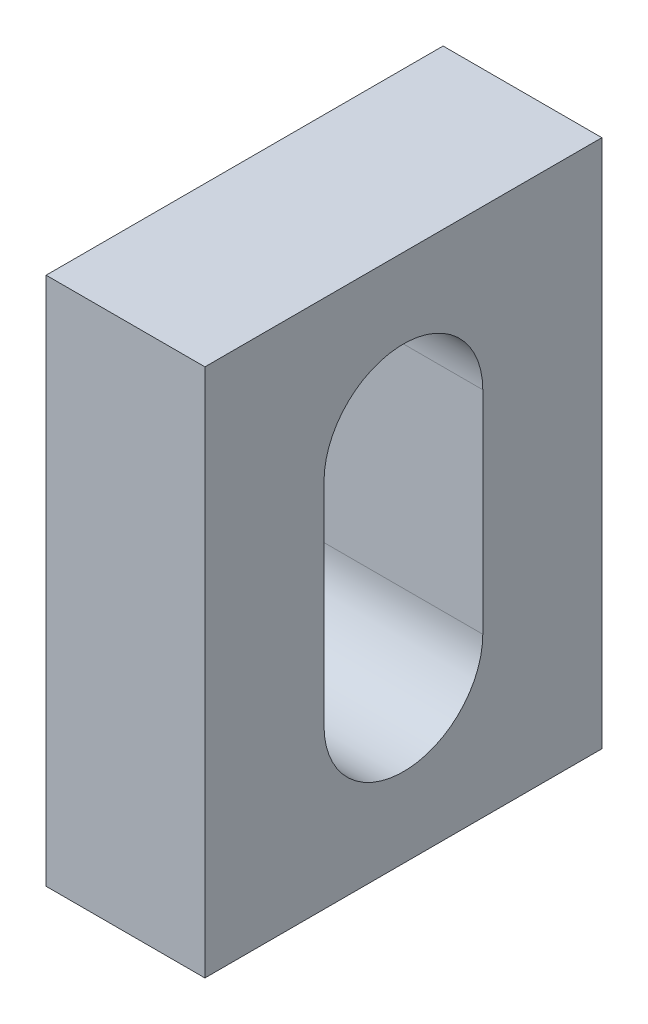
ISO-10303-21;
HEADER;
FILE_DESCRIPTION(('STEP AP214'),'2;1');
FILE_NAME('part.step','',(''),(''),'','','');
FILE_SCHEMA(('AUTOMOTIVE_DESIGN { 1 0 10303 214 1 1 1 1 }'));
ENDSEC;
DATA;
#1=APPLICATION_CONTEXT('core data for automotive mechanical design processes');
#2=APPLICATION_PROTOCOL_DEFINITION('international standard','automotive_design',2000,#1);
#3=PRODUCT_CONTEXT('',#1,'mechanical');
#4=PRODUCT('Part','Part','',(#3));
#5=PRODUCT_RELATED_PRODUCT_CATEGORY('part','',(#4));
#6=PRODUCT_DEFINITION_FORMATION('','',#4);
#7=PRODUCT_DEFINITION_CONTEXT('part definition',#1,'design');
#8=PRODUCT_DEFINITION('design','',#6,#7);
#9=PRODUCT_DEFINITION_SHAPE('','',#8);
#10=(LENGTH_UNIT() NAMED_UNIT(*) SI_UNIT(.MILLI.,.METRE.));
#11=(NAMED_UNIT(*) PLANE_ANGLE_UNIT() SI_UNIT($,.RADIAN.));
#12=(NAMED_UNIT(*) SI_UNIT($,.STERADIAN.) SOLID_ANGLE_UNIT());
#13=UNCERTAINTY_MEASURE_WITH_UNIT(LENGTH_MEASURE(1.E-05),#10,'distance_accuracy_value','');
#14=(GEOMETRIC_REPRESENTATION_CONTEXT(3) GLOBAL_UNCERTAINTY_ASSIGNED_CONTEXT((#13)) GLOBAL_UNIT_ASSIGNED_CONTEXT((#10,
#11,#12)) REPRESENTATION_CONTEXT('',''));
#15=CARTESIAN_POINT('',(0.,0.,0.));
#16=DIRECTION('',(0.,0.,1.));
#17=DIRECTION('',(1.,0.,0.));
#18=AXIS2_PLACEMENT_3D('',#15,#16,#17);
#19=CARTESIAN_POINT('',(6.,0.,0.));
#20=DIRECTION('',(-1.,0.,0.));
#21=DIRECTION('',(0.,0.,1.));
#22=AXIS2_PLACEMENT_3D('',#19,#20,#21);
#23=PLANE('',#22);
#24=DIRECTION('',(0.,-1.,0.));
#25=VECTOR('',#24,1.);
#26=CARTESIAN_POINT('',(6.,0.,0.));
#27=LINE('',#26,#25);
#28=CARTESIAN_POINT('',(6.,20.,0.));
#29=VERTEX_POINT('',#28);
#30=CARTESIAN_POINT('',(6.,0.,0.));
#31=VERTEX_POINT('',#30);
#32=EDGE_CURVE('E134',#29,#31,#27,.T.);
#33=ORIENTED_EDGE('',*,*,#32,.T.);
#34=DIRECTION('',(0.,0.,-1.));
#35=VECTOR('',#34,1.);
#36=CARTESIAN_POINT('',(6.,0.,0.));
#37=LINE('',#36,#35);
#38=CARTESIAN_POINT('',(6.,0.,-15.));
#39=VERTEX_POINT('',#38);
#40=EDGE_CURVE('E137',#31,#39,#37,.T.);
#41=ORIENTED_EDGE('',*,*,#40,.T.);
#42=DIRECTION('',(0.,1.,0.));
#43=VECTOR('',#42,1.);
#44=CARTESIAN_POINT('',(6.,0.,-15.));
#45=LINE('',#44,#43);
#46=CARTESIAN_POINT('',(6.,20.,-15.));
#47=VERTEX_POINT('',#46);
#48=EDGE_CURVE('E140',#39,#47,#45,.T.);
#49=ORIENTED_EDGE('',*,*,#48,.T.);
#50=DIRECTION('',(0.,0.,1.));
#51=VECTOR('',#50,1.);
#52=CARTESIAN_POINT('',(6.,20.,0.));
#53=LINE('',#52,#51);
#54=EDGE_CURVE('E142',#47,#29,#53,.T.);
#55=ORIENTED_EDGE('',*,*,#54,.T.);
#56=EDGE_LOOP('',(#33,#41,#49,#55));
#57=FACE_BOUND('',#56,.T.);
#58=CARTESIAN_POINT('',(6.,6.,-7.5));
#59=DIRECTION('',(1.,0.,0.));
#60=DIRECTION('',(0.,0.,-1.));
#61=AXIS2_PLACEMENT_3D('',#58,#59,#60);
#62=CIRCLE('',#61,3.);
#63=CARTESIAN_POINT('',(6.,6.,-4.5));
#64=VERTEX_POINT('',#63);
#65=CARTESIAN_POINT('',(6.,6.,-10.5));
#66=VERTEX_POINT('',#65);
#67=EDGE_CURVE('E98',#64,#66,#62,.T.);
#68=ORIENTED_EDGE('',*,*,#67,.F.);
#69=DIRECTION('',(0.,-1.,0.));
#70=VECTOR('',#69,1.);
#71=CARTESIAN_POINT('',(6.,6.,-4.5));
#72=LINE('',#71,#70);
#73=CARTESIAN_POINT('',(6.,14.,-4.5));
#74=VERTEX_POINT('',#73);
#75=EDGE_CURVE('E120',#74,#64,#72,.T.);
#76=ORIENTED_EDGE('',*,*,#75,.F.);
#77=CARTESIAN_POINT('',(6.,14.,-7.5));
#78=DIRECTION('',(1.,0.,0.));
#79=DIRECTION('',(0.,0.,-1.));
#80=AXIS2_PLACEMENT_3D('',#77,#78,#79);
#81=CIRCLE('',#80,3.);
#82=CARTESIAN_POINT('',(6.,14.,-10.5));
#83=VERTEX_POINT('',#82);
#84=EDGE_CURVE('E118',#83,#74,#81,.T.);
#85=ORIENTED_EDGE('',*,*,#84,.F.);
#86=DIRECTION('',(0.,1.,0.));
#87=VECTOR('',#86,1.);
#88=CARTESIAN_POINT('',(6.,6.,-10.5));
#89=LINE('',#88,#87);
#90=EDGE_CURVE('E106',#66,#83,#89,.T.);
#91=ORIENTED_EDGE('',*,*,#90,.F.);
#92=EDGE_LOOP('',(#68,#76,#85,#91));
#93=FACE_BOUND('',#92,.T.);
#94=ADVANCED_FACE('F33',(#57,#93),#23,.F.);
#95=CARTESIAN_POINT('',(0.,0.,0.));
#96=DIRECTION('',(-1.,0.,0.));
#97=DIRECTION('',(0.,0.,1.));
#98=AXIS2_PLACEMENT_3D('',#95,#96,#97);
#99=PLANE('',#98);
#100=DIRECTION('',(0.,-1.,0.));
#101=VECTOR('',#100,1.);
#102=CARTESIAN_POINT('',(0.,0.,0.));
#103=LINE('',#102,#101);
#104=CARTESIAN_POINT('',(0.,20.,0.));
#105=VERTEX_POINT('',#104);
#106=CARTESIAN_POINT('',(0.,0.,0.));
#107=VERTEX_POINT('',#106);
#108=EDGE_CURVE('E114',#105,#107,#103,.T.);
#109=ORIENTED_EDGE('',*,*,#108,.F.);
#110=DIRECTION('',(0.,0.,1.));
#111=VECTOR('',#110,1.);
#112=CARTESIAN_POINT('',(0.,20.,0.));
#113=LINE('',#112,#111);
#114=CARTESIAN_POINT('',(0.,20.,-15.));
#115=VERTEX_POINT('',#114);
#116=EDGE_CURVE('E138',#115,#105,#113,.T.);
#117=ORIENTED_EDGE('',*,*,#116,.F.);
#118=DIRECTION('',(0.,1.,0.));
#119=VECTOR('',#118,1.);
#120=CARTESIAN_POINT('',(0.,0.,-15.));
#121=LINE('',#120,#119);
#122=CARTESIAN_POINT('',(0.,0.,-15.));
#123=VERTEX_POINT('',#122);
#124=EDGE_CURVE('E149',#123,#115,#121,.T.);
#125=ORIENTED_EDGE('',*,*,#124,.F.);
#126=DIRECTION('',(0.,0.,-1.));
#127=VECTOR('',#126,1.);
#128=CARTESIAN_POINT('',(0.,0.,0.));
#129=LINE('',#128,#127);
#130=EDGE_CURVE('E147',#107,#123,#129,.T.);
#131=ORIENTED_EDGE('',*,*,#130,.F.);
#132=EDGE_LOOP('',(#109,#117,#125,#131));
#133=FACE_BOUND('',#132,.T.);
#134=DIRECTION('',(0.,-1.,0.));
#135=VECTOR('',#134,1.);
#136=CARTESIAN_POINT('',(0.,6.,-4.5));
#137=LINE('',#136,#135);
#138=CARTESIAN_POINT('',(0.,14.,-4.5));
#139=VERTEX_POINT('',#138);
#140=CARTESIAN_POINT('',(0.,6.,-4.5));
#141=VERTEX_POINT('',#140);
#142=EDGE_CURVE('E107',#139,#141,#137,.T.);
#143=ORIENTED_EDGE('',*,*,#142,.T.);
#144=CARTESIAN_POINT('',(0.,6.,-7.5));
#145=DIRECTION('',(1.,0.,0.));
#146=DIRECTION('',(0.,0.,-1.));
#147=AXIS2_PLACEMENT_3D('',#144,#145,#146);
#148=CIRCLE('',#147,3.);
#149=CARTESIAN_POINT('',(0.,6.,-10.5));
#150=VERTEX_POINT('',#149);
#151=EDGE_CURVE('E56',#141,#150,#148,.T.);
#152=ORIENTED_EDGE('',*,*,#151,.T.);
#153=DIRECTION('',(0.,1.,0.));
#154=VECTOR('',#153,1.);
#155=CARTESIAN_POINT('',(0.,6.,-10.5));
#156=LINE('',#155,#154);
#157=CARTESIAN_POINT('',(0.,14.,-10.5));
#158=VERTEX_POINT('',#157);
#159=EDGE_CURVE('E113',#150,#158,#156,.T.);
#160=ORIENTED_EDGE('',*,*,#159,.T.);
#161=CARTESIAN_POINT('',(0.,14.,-7.5));
#162=DIRECTION('',(1.,0.,0.));
#163=DIRECTION('',(0.,0.,-1.));
#164=AXIS2_PLACEMENT_3D('',#161,#162,#163);
#165=CIRCLE('',#164,3.);
#166=EDGE_CURVE('E126',#158,#139,#165,.T.);
#167=ORIENTED_EDGE('',*,*,#166,.T.);
#168=EDGE_LOOP('',(#143,#152,#160,#167));
#169=FACE_BOUND('',#168,.T.);
#170=ADVANCED_FACE('F167',(#133,#169),#99,.T.);
#171=CARTESIAN_POINT('',(6.,0.,0.));
#172=DIRECTION('',(0.,0.,-1.));
#173=DIRECTION('',(0.,1.,0.));
#174=AXIS2_PLACEMENT_3D('',#171,#172,#173);
#175=PLANE('',#174);
#176=ORIENTED_EDGE('',*,*,#108,.T.);
#177=DIRECTION('',(-1.,0.,0.));
#178=VECTOR('',#177,1.);
#179=CARTESIAN_POINT('',(6.,0.,0.));
#180=LINE('',#179,#178);
#181=EDGE_CURVE('E11',#31,#107,#180,.T.);
#182=ORIENTED_EDGE('',*,*,#181,.F.);
#183=ORIENTED_EDGE('',*,*,#32,.F.);
#184=DIRECTION('',(-1.,0.,0.));
#185=VECTOR('',#184,1.);
#186=CARTESIAN_POINT('',(6.,20.,0.));
#187=LINE('',#186,#185);
#188=EDGE_CURVE('E144',#29,#105,#187,.T.);
#189=ORIENTED_EDGE('',*,*,#188,.T.);
#190=EDGE_LOOP('',(#176,#182,#183,#189));
#191=FACE_BOUND('',#190,.T.);
#192=ADVANCED_FACE('F35',(#191),#175,.F.);
#193=CARTESIAN_POINT('',(6.,0.,0.));
#194=DIRECTION('',(0.,1.,0.));
#195=DIRECTION('',(0.,0.,1.));
#196=AXIS2_PLACEMENT_3D('',#193,#194,#195);
#197=PLANE('',#196);
#198=ORIENTED_EDGE('',*,*,#130,.T.);
#199=DIRECTION('',(-1.,0.,0.));
#200=VECTOR('',#199,1.);
#201=CARTESIAN_POINT('',(6.,0.,-15.));
#202=LINE('',#201,#200);
#203=EDGE_CURVE('E41',#39,#123,#202,.T.);
#204=ORIENTED_EDGE('',*,*,#203,.F.);
#205=ORIENTED_EDGE('',*,*,#40,.F.);
#206=ORIENTED_EDGE('',*,*,#181,.T.);
#207=EDGE_LOOP('',(#198,#204,#205,#206));
#208=FACE_BOUND('',#207,.T.);
#209=ADVANCED_FACE('F177',(#208),#197,.F.);
#210=CARTESIAN_POINT('',(6.,0.,-15.));
#211=DIRECTION('',(0.,0.,1.));
#212=DIRECTION('',(0.,-1.,0.));
#213=AXIS2_PLACEMENT_3D('',#210,#211,#212);
#214=PLANE('',#213);
#215=ORIENTED_EDGE('',*,*,#124,.T.);
#216=DIRECTION('',(-1.,0.,0.));
#217=VECTOR('',#216,1.);
#218=CARTESIAN_POINT('',(6.,20.,-15.));
#219=LINE('',#218,#217);
#220=EDGE_CURVE('E154',#47,#115,#219,.T.);
#221=ORIENTED_EDGE('',*,*,#220,.F.);
#222=ORIENTED_EDGE('',*,*,#48,.F.);
#223=ORIENTED_EDGE('',*,*,#203,.T.);
#224=EDGE_LOOP('',(#215,#221,#222,#223));
#225=FACE_BOUND('',#224,.T.);
#226=ADVANCED_FACE('F161',(#225),#214,.F.);
#227=CARTESIAN_POINT('',(6.,20.,0.));
#228=DIRECTION('',(0.,-1.,0.));
#229=DIRECTION('',(0.,0.,-1.));
#230=AXIS2_PLACEMENT_3D('',#227,#228,#229);
#231=PLANE('',#230);
#232=ORIENTED_EDGE('',*,*,#116,.T.);
#233=ORIENTED_EDGE('',*,*,#188,.F.);
#234=ORIENTED_EDGE('',*,*,#54,.F.);
#235=ORIENTED_EDGE('',*,*,#220,.T.);
#236=EDGE_LOOP('',(#232,#233,#234,#235));
#237=FACE_BOUND('',#236,.T.);
#238=ADVANCED_FACE('F171',(#237),#231,.F.);
#239=CARTESIAN_POINT('',(6.,6.,-7.5));
#240=DIRECTION('',(-1.,0.,0.));
#241=DIRECTION('',(0.,0.,1.));
#242=AXIS2_PLACEMENT_3D('',#239,#240,#241);
#243=CYLINDRICAL_SURFACE('',#242,3.);
#244=ORIENTED_EDGE('',*,*,#151,.F.);
#245=DIRECTION('',(-1.,0.,0.));
#246=VECTOR('',#245,1.);
#247=CARTESIAN_POINT('',(6.,6.,-4.5));
#248=LINE('',#247,#246);
#249=EDGE_CURVE('E102',#64,#141,#248,.T.);
#250=ORIENTED_EDGE('',*,*,#249,.F.);
#251=ORIENTED_EDGE('',*,*,#67,.T.);
#252=DIRECTION('',(-1.,0.,0.));
#253=VECTOR('',#252,1.);
#254=CARTESIAN_POINT('',(6.,6.,-10.5));
#255=LINE('',#254,#253);
#256=EDGE_CURVE('E101',#66,#150,#255,.T.);
#257=ORIENTED_EDGE('',*,*,#256,.T.);
#258=EDGE_LOOP('',(#244,#250,#251,#257));
#259=FACE_BOUND('',#258,.T.);
#260=ADVANCED_FACE('F100',(#259),#243,.F.);
#261=CARTESIAN_POINT('',(6.,6.,-10.5));
#262=DIRECTION('',(0.,0.,1.));
#263=DIRECTION('',(1.,0.,0.));
#264=AXIS2_PLACEMENT_3D('',#261,#262,#263);
#265=PLANE('',#264);
#266=ORIENTED_EDGE('',*,*,#159,.F.);
#267=ORIENTED_EDGE('',*,*,#256,.F.);
#268=ORIENTED_EDGE('',*,*,#90,.T.);
#269=DIRECTION('',(-1.,0.,0.));
#270=VECTOR('',#269,1.);
#271=CARTESIAN_POINT('',(6.,14.,-10.5));
#272=LINE('',#271,#270);
#273=EDGE_CURVE('E115',#83,#158,#272,.T.);
#274=ORIENTED_EDGE('',*,*,#273,.T.);
#275=EDGE_LOOP('',(#266,#267,#268,#274));
#276=FACE_BOUND('',#275,.T.);
#277=ADVANCED_FACE('F110',(#276),#265,.T.);
#278=CARTESIAN_POINT('',(6.,14.,-7.5));
#279=DIRECTION('',(-1.,0.,0.));
#280=DIRECTION('',(0.,0.,1.));
#281=AXIS2_PLACEMENT_3D('',#278,#279,#280);
#282=CYLINDRICAL_SURFACE('',#281,3.);
#283=ORIENTED_EDGE('',*,*,#166,.F.);
#284=ORIENTED_EDGE('',*,*,#273,.F.);
#285=ORIENTED_EDGE('',*,*,#84,.T.);
#286=DIRECTION('',(-1.,0.,0.));
#287=VECTOR('',#286,1.);
#288=CARTESIAN_POINT('',(6.,14.,-4.5));
#289=LINE('',#288,#287);
#290=EDGE_CURVE('E48',#74,#139,#289,.T.);
#291=ORIENTED_EDGE('',*,*,#290,.T.);
#292=EDGE_LOOP('',(#283,#284,#285,#291));
#293=FACE_BOUND('',#292,.T.);
#294=ADVANCED_FACE('F200',(#293),#282,.F.);
#295=CARTESIAN_POINT('',(6.,6.,-4.5));
#296=DIRECTION('',(0.,0.,-1.));
#297=DIRECTION('',(-1.,0.,0.));
#298=AXIS2_PLACEMENT_3D('',#295,#296,#297);
#299=PLANE('',#298);
#300=ORIENTED_EDGE('',*,*,#142,.F.);
#301=ORIENTED_EDGE('',*,*,#290,.F.);
#302=ORIENTED_EDGE('',*,*,#75,.T.);
#303=ORIENTED_EDGE('',*,*,#249,.T.);
#304=EDGE_LOOP('',(#300,#301,#302,#303));
#305=FACE_BOUND('',#304,.T.);
#306=ADVANCED_FACE('F204',(#305),#299,.T.);
#307=CLOSED_SHELL('',(#94,#170,#192,#209,#226,#238,#260,#277,#294,#306));
#308=MANIFOLD_SOLID_BREP('B2',#307);
#309=ADVANCED_BREP_SHAPE_REPRESENTATION('',(#18,#308),#14);
#310=SHAPE_DEFINITION_REPRESENTATION(#9,#309);
ENDSEC;
END-ISO-10303-21;
